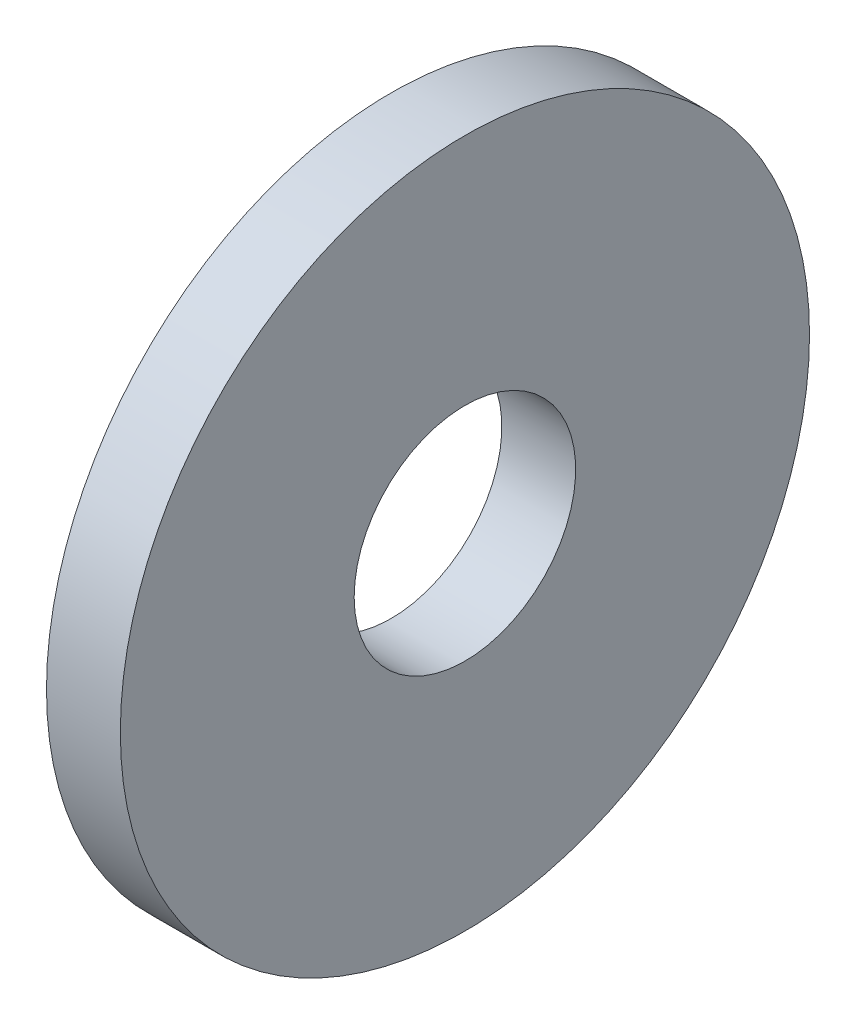
ISO-10303-21;
HEADER;
FILE_DESCRIPTION(('STEP AP214'),'2;1');
FILE_NAME('part.step','',(''),(''),'','','');
FILE_SCHEMA(('AUTOMOTIVE_DESIGN { 1 0 10303 214 1 1 1 1 }'));
ENDSEC;
DATA;
#1=APPLICATION_CONTEXT('core data for automotive mechanical design processes');
#2=APPLICATION_PROTOCOL_DEFINITION('international standard','automotive_design',2000,#1);
#3=PRODUCT_CONTEXT('',#1,'mechanical');
#4=PRODUCT('Part','Part','',(#3));
#5=PRODUCT_RELATED_PRODUCT_CATEGORY('part','',(#4));
#6=PRODUCT_DEFINITION_FORMATION('','',#4);
#7=PRODUCT_DEFINITION_CONTEXT('part definition',#1,'design');
#8=PRODUCT_DEFINITION('design','',#6,#7);
#9=PRODUCT_DEFINITION_SHAPE('','',#8);
#10=(LENGTH_UNIT() NAMED_UNIT(*) SI_UNIT(.MILLI.,.METRE.));
#11=(NAMED_UNIT(*) PLANE_ANGLE_UNIT() SI_UNIT($,.RADIAN.));
#12=(NAMED_UNIT(*) SI_UNIT($,.STERADIAN.) SOLID_ANGLE_UNIT());
#13=UNCERTAINTY_MEASURE_WITH_UNIT(LENGTH_MEASURE(1.E-05),#10,'distance_accuracy_value','');
#14=(GEOMETRIC_REPRESENTATION_CONTEXT(3) GLOBAL_UNCERTAINTY_ASSIGNED_CONTEXT((#13)) GLOBAL_UNIT_ASSIGNED_CONTEXT((#10,
#11,#12)) REPRESENTATION_CONTEXT('',''));
#15=CARTESIAN_POINT('',(0.,0.,0.));
#16=DIRECTION('',(0.,0.,1.));
#17=DIRECTION('',(1.,0.,0.));
#18=AXIS2_PLACEMENT_3D('',#15,#16,#17);
#19=CARTESIAN_POINT('',(-34.9249999999999,0.,0.));
#20=DIRECTION('',(-1.,0.,0.));
#21=DIRECTION('',(0.,0.,1.));
#22=AXIS2_PLACEMENT_3D('',#19,#20,#21);
#23=CYLINDRICAL_SURFACE('',#22,4.5);
#24=CARTESIAN_POINT('',(0.,0.,0.));
#25=DIRECTION('',(-1.,0.,0.));
#26=DIRECTION('',(0.,0.,1.));
#27=AXIS2_PLACEMENT_3D('',#24,#25,#26);
#28=CIRCLE('',#27,4.5);
#29=CARTESIAN_POINT('',(0.,0.,4.5));
#30=VERTEX_POINT('',#29);
#31=EDGE_CURVE('E10',#30,#30,#28,.T.);
#32=ORIENTED_EDGE('',*,*,#31,.F.);
#33=EDGE_LOOP('',(#32));
#34=FACE_BOUND('',#33,.T.);
#35=CARTESIAN_POINT('',(-3.,0.,0.));
#36=DIRECTION('',(-1.,0.,0.));
#37=DIRECTION('',(0.,0.,1.));
#38=AXIS2_PLACEMENT_3D('',#35,#36,#37);
#39=CIRCLE('',#38,4.5);
#40=CARTESIAN_POINT('',(-3.,0.,4.5));
#41=VERTEX_POINT('',#40);
#42=EDGE_CURVE('E44',#41,#41,#39,.T.);
#43=ORIENTED_EDGE('',*,*,#42,.T.);
#44=EDGE_LOOP('',(#43));
#45=FACE_BOUND('',#44,.T.);
#46=ADVANCED_FACE('F30',(#34,#45),#23,.F.);
#47=CARTESIAN_POINT('',(0.,4.5,0.));
#48=DIRECTION('',(-1.,0.,0.));
#49=DIRECTION('',(0.,0.,1.));
#50=AXIS2_PLACEMENT_3D('',#47,#48,#49);
#51=PLANE('',#50);
#52=CARTESIAN_POINT('',(0.,0.,0.));
#53=DIRECTION('',(-1.,0.,0.));
#54=DIRECTION('',(0.,0.,1.));
#55=AXIS2_PLACEMENT_3D('',#52,#53,#54);
#56=CIRCLE('',#55,14.);
#57=CARTESIAN_POINT('',(0.,0.,14.));
#58=VERTEX_POINT('',#57);
#59=EDGE_CURVE('E36',#58,#58,#56,.T.);
#60=ORIENTED_EDGE('',*,*,#59,.F.);
#61=EDGE_LOOP('',(#60));
#62=FACE_BOUND('',#61,.T.);
#63=ORIENTED_EDGE('',*,*,#31,.T.);
#64=EDGE_LOOP('',(#63));
#65=FACE_BOUND('',#64,.T.);
#66=ADVANCED_FACE('F59',(#62,#65),#51,.F.);
#67=CARTESIAN_POINT('',(-34.9249999999999,0.,0.));
#68=DIRECTION('',(-1.,0.,0.));
#69=DIRECTION('',(0.,0.,1.));
#70=AXIS2_PLACEMENT_3D('',#67,#68,#69);
#71=CYLINDRICAL_SURFACE('',#70,14.);
#72=CARTESIAN_POINT('',(-3.,0.,0.));
#73=DIRECTION('',(-1.,0.,0.));
#74=DIRECTION('',(0.,0.,1.));
#75=AXIS2_PLACEMENT_3D('',#72,#73,#74);
#76=CIRCLE('',#75,14.);
#77=CARTESIAN_POINT('',(-3.,0.,14.));
#78=VERTEX_POINT('',#77);
#79=EDGE_CURVE('E40',#78,#78,#76,.T.);
#80=ORIENTED_EDGE('',*,*,#79,.F.);
#81=EDGE_LOOP('',(#80));
#82=FACE_BOUND('',#81,.T.);
#83=ORIENTED_EDGE('',*,*,#59,.T.);
#84=EDGE_LOOP('',(#83));
#85=FACE_BOUND('',#84,.T.);
#86=ADVANCED_FACE('F54',(#82,#85),#71,.T.);
#87=CARTESIAN_POINT('',(-3.,14.,0.));
#88=DIRECTION('',(1.,0.,0.));
#89=DIRECTION('',(0.,0.,-1.));
#90=AXIS2_PLACEMENT_3D('',#87,#88,#89);
#91=PLANE('',#90);
#92=ORIENTED_EDGE('',*,*,#42,.F.);
#93=EDGE_LOOP('',(#92));
#94=FACE_BOUND('',#93,.T.);
#95=ORIENTED_EDGE('',*,*,#79,.T.);
#96=EDGE_LOOP('',(#95));
#97=FACE_BOUND('',#96,.T.);
#98=ADVANCED_FACE('F51',(#94,#97),#91,.F.);
#99=CLOSED_SHELL('',(#46,#66,#86,#98));
#100=MANIFOLD_SOLID_BREP('B2',#99);
#101=ADVANCED_BREP_SHAPE_REPRESENTATION('',(#18,#100),#14);
#102=SHAPE_DEFINITION_REPRESENTATION(#9,#101);
ENDSEC;
END-ISO-10303-21;
